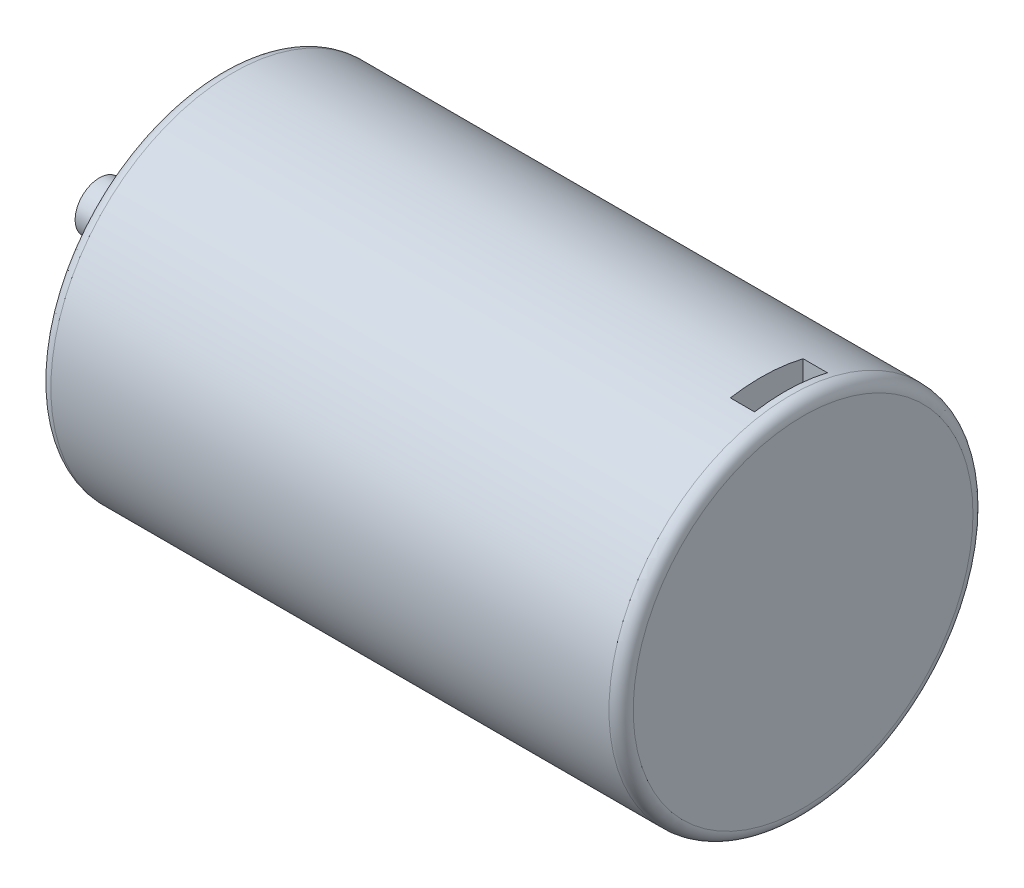
ISO-10303-21;
HEADER;
FILE_DESCRIPTION(('STEP AP214'),'2;1');
FILE_NAME('part.step','',(''),(''),'','','');
FILE_SCHEMA(('AUTOMOTIVE_DESIGN { 1 0 10303 214 1 1 1 1 }'));
ENDSEC;
DATA;
#1=APPLICATION_CONTEXT('core data for automotive mechanical design processes');
#2=APPLICATION_PROTOCOL_DEFINITION('international standard','automotive_design',2000,#1);
#3=PRODUCT_CONTEXT('',#1,'mechanical');
#4=PRODUCT('Part','Part','',(#3));
#5=PRODUCT_RELATED_PRODUCT_CATEGORY('part','',(#4));
#6=PRODUCT_DEFINITION_FORMATION('','',#4);
#7=PRODUCT_DEFINITION_CONTEXT('part definition',#1,'design');
#8=PRODUCT_DEFINITION('design','',#6,#7);
#9=PRODUCT_DEFINITION_SHAPE('','',#8);
#10=(LENGTH_UNIT() NAMED_UNIT(*) SI_UNIT(.MILLI.,.METRE.));
#11=(NAMED_UNIT(*) PLANE_ANGLE_UNIT() SI_UNIT($,.RADIAN.));
#12=(NAMED_UNIT(*) SI_UNIT($,.STERADIAN.) SOLID_ANGLE_UNIT());
#13=UNCERTAINTY_MEASURE_WITH_UNIT(LENGTH_MEASURE(1.E-05),#10,'distance_accuracy_value','');
#14=(GEOMETRIC_REPRESENTATION_CONTEXT(3) GLOBAL_UNCERTAINTY_ASSIGNED_CONTEXT((#13)) GLOBAL_UNIT_ASSIGNED_CONTEXT((#10,
#11,#12)) REPRESENTATION_CONTEXT('',''));
#15=CARTESIAN_POINT('',(0.,0.,0.));
#16=DIRECTION('',(0.,0.,1.));
#17=DIRECTION('',(1.,0.,0.));
#18=AXIS2_PLACEMENT_3D('',#15,#16,#17);
#19=CARTESIAN_POINT('',(-48.,0.,0.));
#20=DIRECTION('',(1.,0.,0.));
#21=DIRECTION('',(0.,0.,-1.));
#22=AXIS2_PLACEMENT_3D('',#19,#20,#21);
#23=CYLINDRICAL_SURFACE('',#22,15.);
#24=CARTESIAN_POINT('',(-1.5,0.,0.));
#25=DIRECTION('',(1.,0.,0.));
#26=DIRECTION('',(0.,0.,-1.));
#27=AXIS2_PLACEMENT_3D('',#24,#25,#26);
#28=CIRCLE('',#27,15.);
#29=CARTESIAN_POINT('',(-1.5,14.790199457749,2.5));
#30=VERTEX_POINT('',#29);
#31=CARTESIAN_POINT('',(-1.5,14.5859521458148,-3.5));
#32=VERTEX_POINT('',#31);
#33=EDGE_CURVE('E128',#30,#32,#28,.F.);
#34=ORIENTED_EDGE('',*,*,#33,.F.);
#35=DIRECTION('',(1.,0.,0.));
#36=VECTOR('',#35,1.);
#37=CARTESIAN_POINT('',(-48.,14.790199457749,2.5));
#38=LINE('',#37,#36);
#39=CARTESIAN_POINT('',(-3.5,14.790199457749,2.5));
#40=VERTEX_POINT('',#39);
#41=EDGE_CURVE('E11',#40,#30,#38,.T.);
#42=ORIENTED_EDGE('',*,*,#41,.F.);
#43=CARTESIAN_POINT('',(-3.5,0.,0.));
#44=DIRECTION('',(-1.,0.,0.));
#45=DIRECTION('',(0.,0.,1.));
#46=AXIS2_PLACEMENT_3D('',#43,#44,#45);
#47=CIRCLE('',#46,15.);
#48=CARTESIAN_POINT('',(-3.5,14.5859521458148,-3.5));
#49=VERTEX_POINT('',#48);
#50=EDGE_CURVE('E43',#49,#40,#47,.F.);
#51=ORIENTED_EDGE('',*,*,#50,.F.);
#52=DIRECTION('',(1.,0.,0.));
#53=VECTOR('',#52,1.);
#54=CARTESIAN_POINT('',(-48.,14.5859521458148,-3.5));
#55=LINE('',#54,#53);
#56=EDGE_CURVE('E130',#32,#49,#55,.F.);
#57=ORIENTED_EDGE('',*,*,#56,.F.);
#58=EDGE_LOOP('',(#34,#42,#51,#57));
#59=FACE_BOUND('',#58,.T.);
#60=CARTESIAN_POINT('',(-1.,0.,0.));
#61=DIRECTION('',(1.,0.,0.));
#62=DIRECTION('',(0.,0.,-1.));
#63=AXIS2_PLACEMENT_3D('',#60,#61,#62);
#64=CIRCLE('',#63,15.);
#65=CARTESIAN_POINT('',(-1.,0.,-15.));
#66=VERTEX_POINT('',#65);
#67=EDGE_CURVE('E125',#66,#66,#64,.F.);
#68=ORIENTED_EDGE('',*,*,#67,.T.);
#69=EDGE_LOOP('',(#68));
#70=FACE_BOUND('',#69,.T.);
#71=CARTESIAN_POINT('',(-47.,0.,0.));
#72=DIRECTION('',(1.,0.,0.));
#73=DIRECTION('',(0.,0.,-1.));
#74=AXIS2_PLACEMENT_3D('',#71,#72,#73);
#75=CIRCLE('',#74,15.);
#76=CARTESIAN_POINT('',(-47.,0.,-15.));
#77=VERTEX_POINT('',#76);
#78=EDGE_CURVE('E116',#77,#77,#75,.T.);
#79=ORIENTED_EDGE('',*,*,#78,.T.);
#80=EDGE_LOOP('',(#79));
#81=FACE_BOUND('',#80,.T.);
#82=ADVANCED_FACE('F35',(#59,#70,#81),#23,.T.);
#83=CARTESIAN_POINT('',(-48.,0.,0.));
#84=DIRECTION('',(1.,0.,0.));
#85=DIRECTION('',(0.,0.,-1.));
#86=AXIS2_PLACEMENT_3D('',#83,#84,#85);
#87=PLANE('',#86);
#88=CARTESIAN_POINT('',(-48.,0.,0.));
#89=DIRECTION('',(1.,0.,0.));
#90=DIRECTION('',(0.,0.,-1.));
#91=AXIS2_PLACEMENT_3D('',#88,#89,#90);
#92=CIRCLE('',#91,14.);
#93=CARTESIAN_POINT('',(-48.,0.,-14.));
#94=VERTEX_POINT('',#93);
#95=EDGE_CURVE('E119',#94,#94,#92,.F.);
#96=ORIENTED_EDGE('',*,*,#95,.T.);
#97=EDGE_LOOP('',(#96));
#98=FACE_BOUND('',#97,.T.);
#99=CARTESIAN_POINT('',(-48.,0.,0.));
#100=DIRECTION('',(1.,0.,0.));
#101=DIRECTION('',(0.,0.,-1.));
#102=AXIS2_PLACEMENT_3D('',#99,#100,#101);
#103=CIRCLE('',#102,3.);
#104=CARTESIAN_POINT('',(-48.,0.,-3.));
#105=VERTEX_POINT('',#104);
#106=EDGE_CURVE('E111',#105,#105,#103,.F.);
#107=ORIENTED_EDGE('',*,*,#106,.F.);
#108=EDGE_LOOP('',(#107));
#109=FACE_BOUND('',#108,.T.);
#110=ADVANCED_FACE('F145',(#98,#109),#87,.F.);
#111=CARTESIAN_POINT('',(0.,0.,0.));
#112=DIRECTION('',(1.,0.,0.));
#113=DIRECTION('',(0.,0.,-1.));
#114=AXIS2_PLACEMENT_3D('',#111,#112,#113);
#115=PLANE('',#114);
#116=CARTESIAN_POINT('',(0.,0.,0.));
#117=DIRECTION('',(1.,0.,0.));
#118=DIRECTION('',(0.,0.,-1.));
#119=AXIS2_PLACEMENT_3D('',#116,#117,#118);
#120=CIRCLE('',#119,14.);
#121=CARTESIAN_POINT('',(0.,0.,-14.));
#122=VERTEX_POINT('',#121);
#123=EDGE_CURVE('E122',#122,#122,#120,.T.);
#124=ORIENTED_EDGE('',*,*,#123,.T.);
#125=EDGE_LOOP('',(#124));
#126=FACE_BOUND('',#125,.T.);
#127=ADVANCED_FACE('F150',(#126),#115,.T.);
#128=CARTESIAN_POINT('',(-51.,0.,0.));
#129=DIRECTION('',(1.,0.,0.));
#130=DIRECTION('',(0.,0.,-1.));
#131=AXIS2_PLACEMENT_3D('',#128,#129,#130);
#132=CYLINDRICAL_SURFACE('',#131,3.);
#133=CARTESIAN_POINT('',(-51.,0.,0.));
#134=DIRECTION('',(-1.,0.,0.));
#135=DIRECTION('',(0.,0.,1.));
#136=AXIS2_PLACEMENT_3D('',#133,#134,#135);
#137=CIRCLE('',#136,3.);
#138=CARTESIAN_POINT('',(-51.,0.,3.));
#139=VERTEX_POINT('',#138);
#140=EDGE_CURVE('E100',#139,#139,#137,.T.);
#141=ORIENTED_EDGE('',*,*,#140,.F.);
#142=EDGE_LOOP('',(#141));
#143=FACE_BOUND('',#142,.T.);
#144=ORIENTED_EDGE('',*,*,#106,.T.);
#145=EDGE_LOOP('',(#144));
#146=FACE_BOUND('',#145,.T.);
#147=ADVANCED_FACE('F173',(#143,#146),#132,.T.);
#148=CARTESIAN_POINT('',(-51.,0.,0.));
#149=DIRECTION('',(-1.,0.,0.));
#150=DIRECTION('',(0.,0.,1.));
#151=AXIS2_PLACEMENT_3D('',#148,#149,#150);
#152=PLANE('',#151);
#153=CARTESIAN_POINT('',(-51.,0.,0.));
#154=DIRECTION('',(-1.,0.,0.));
#155=DIRECTION('',(0.,0.,1.));
#156=AXIS2_PLACEMENT_3D('',#153,#154,#155);
#157=CIRCLE('',#156,2.);
#158=CARTESIAN_POINT('',(-51.,0.,2.));
#159=VERTEX_POINT('',#158);
#160=EDGE_CURVE('E107',#159,#159,#157,.T.);
#161=ORIENTED_EDGE('',*,*,#160,.F.);
#162=EDGE_LOOP('',(#161));
#163=FACE_BOUND('',#162,.T.);
#164=ORIENTED_EDGE('',*,*,#140,.T.);
#165=EDGE_LOOP('',(#164));
#166=FACE_BOUND('',#165,.T.);
#167=ADVANCED_FACE('F175',(#163,#166),#152,.T.);
#168=CARTESIAN_POINT('',(-58.,0.,0.));
#169=DIRECTION('',(-1.,0.,0.));
#170=DIRECTION('',(0.,0.,1.));
#171=AXIS2_PLACEMENT_3D('',#168,#169,#170);
#172=PLANE('',#171);
#173=CARTESIAN_POINT('',(-58.,0.,0.));
#174=DIRECTION('',(-1.,0.,0.));
#175=DIRECTION('',(0.,0.,1.));
#176=AXIS2_PLACEMENT_3D('',#173,#174,#175);
#177=CIRCLE('',#176,2.);
#178=CARTESIAN_POINT('',(-58.,0.,2.));
#179=VERTEX_POINT('',#178);
#180=EDGE_CURVE('E108',#179,#179,#177,.T.);
#181=ORIENTED_EDGE('',*,*,#180,.T.);
#182=EDGE_LOOP('',(#181));
#183=FACE_BOUND('',#182,.T.);
#184=ADVANCED_FACE('F163',(#183),#172,.T.);
#185=CARTESIAN_POINT('',(-58.,0.,0.));
#186=DIRECTION('',(1.,0.,0.));
#187=DIRECTION('',(0.,0.,-1.));
#188=AXIS2_PLACEMENT_3D('',#185,#186,#187);
#189=CYLINDRICAL_SURFACE('',#188,2.);
#190=ORIENTED_EDGE('',*,*,#160,.T.);
#191=EDGE_LOOP('',(#190));
#192=FACE_BOUND('',#191,.T.);
#193=ORIENTED_EDGE('',*,*,#180,.F.);
#194=EDGE_LOOP('',(#193));
#195=FACE_BOUND('',#194,.T.);
#196=ADVANCED_FACE('F156',(#192,#195),#189,.T.);
#197=CARTESIAN_POINT('',(-47.,0.,0.));
#198=DIRECTION('',(1.,0.,0.));
#199=DIRECTION('',(0.,0.,-1.));
#200=AXIS2_PLACEMENT_3D('',#197,#198,#199);
#201=TOROIDAL_SURFACE('',#200,14.,1.);
#202=ORIENTED_EDGE('',*,*,#95,.F.);
#203=EDGE_LOOP('',(#202));
#204=FACE_BOUND('',#203,.T.);
#205=ORIENTED_EDGE('',*,*,#78,.F.);
#206=EDGE_LOOP('',(#205));
#207=FACE_BOUND('',#206,.T.);
#208=ADVANCED_FACE('F154',(#204,#207),#201,.T.);
#209=CARTESIAN_POINT('',(-1.,0.,0.));
#210=DIRECTION('',(1.,0.,0.));
#211=DIRECTION('',(0.,0.,-1.));
#212=AXIS2_PLACEMENT_3D('',#209,#210,#211);
#213=TOROIDAL_SURFACE('',#212,14.,1.);
#214=ORIENTED_EDGE('',*,*,#67,.F.);
#215=EDGE_LOOP('',(#214));
#216=FACE_BOUND('',#215,.T.);
#217=ORIENTED_EDGE('',*,*,#123,.F.);
#218=EDGE_LOOP('',(#217));
#219=FACE_BOUND('',#218,.T.);
#220=ADVANCED_FACE('F37',(#216,#219),#213,.T.);
#221=CARTESIAN_POINT('',(-3.5,12.,-3.5));
#222=DIRECTION('',(-1.,0.,0.));
#223=DIRECTION('',(0.,0.,1.));
#224=AXIS2_PLACEMENT_3D('',#221,#222,#223);
#225=PLANE('',#224);
#226=DIRECTION('',(0.,1.,0.));
#227=VECTOR('',#226,1.);
#228=CARTESIAN_POINT('',(-3.5,12.,-3.5));
#229=LINE('',#228,#227);
#230=CARTESIAN_POINT('',(-3.5,12.,-3.5));
#231=VERTEX_POINT('',#230);
#232=EDGE_CURVE('E98',#231,#49,#229,.T.);
#233=ORIENTED_EDGE('',*,*,#232,.T.);
#234=ORIENTED_EDGE('',*,*,#50,.T.);
#235=DIRECTION('',(0.,1.,0.));
#236=VECTOR('',#235,1.);
#237=CARTESIAN_POINT('',(-3.5,12.,2.5));
#238=LINE('',#237,#236);
#239=CARTESIAN_POINT('',(-3.5,12.,2.5));
#240=VERTEX_POINT('',#239);
#241=EDGE_CURVE('E49',#240,#40,#238,.T.);
#242=ORIENTED_EDGE('',*,*,#241,.F.);
#243=DIRECTION('',(0.,0.,1.));
#244=VECTOR('',#243,1.);
#245=CARTESIAN_POINT('',(-3.5,12.,-3.5));
#246=LINE('',#245,#244);
#247=EDGE_CURVE('E78',#231,#240,#246,.T.);
#248=ORIENTED_EDGE('',*,*,#247,.F.);
#249=EDGE_LOOP('',(#233,#234,#242,#248));
#250=FACE_BOUND('',#249,.T.);
#251=ADVANCED_FACE('F76',(#250),#225,.F.);
#252=CARTESIAN_POINT('',(-3.5,12.,-3.5));
#253=DIRECTION('',(0.,0.,-1.));
#254=DIRECTION('',(-1.,0.,0.));
#255=AXIS2_PLACEMENT_3D('',#252,#253,#254);
#256=PLANE('',#255);
#257=ORIENTED_EDGE('',*,*,#56,.T.);
#258=ORIENTED_EDGE('',*,*,#232,.F.);
#259=DIRECTION('',(-1.,0.,0.));
#260=VECTOR('',#259,1.);
#261=CARTESIAN_POINT('',(-3.5,12.,-3.5));
#262=LINE('',#261,#260);
#263=CARTESIAN_POINT('',(-1.5,12.,-3.5));
#264=VERTEX_POINT('',#263);
#265=EDGE_CURVE('E81',#264,#231,#262,.T.);
#266=ORIENTED_EDGE('',*,*,#265,.F.);
#267=DIRECTION('',(0.,1.,0.));
#268=VECTOR('',#267,1.);
#269=CARTESIAN_POINT('',(-1.5,12.,-3.5));
#270=LINE('',#269,#268);
#271=EDGE_CURVE('E101',#264,#32,#270,.T.);
#272=ORIENTED_EDGE('',*,*,#271,.T.);
#273=EDGE_LOOP('',(#257,#258,#266,#272));
#274=FACE_BOUND('',#273,.T.);
#275=ADVANCED_FACE('F132',(#274),#256,.F.);
#276=CARTESIAN_POINT('',(-1.5,12.,-3.5));
#277=DIRECTION('',(1.,0.,0.));
#278=DIRECTION('',(0.,0.,-1.));
#279=AXIS2_PLACEMENT_3D('',#276,#277,#278);
#280=PLANE('',#279);
#281=DIRECTION('',(0.,1.,0.));
#282=VECTOR('',#281,1.);
#283=CARTESIAN_POINT('',(-1.5,12.,2.5));
#284=LINE('',#283,#282);
#285=CARTESIAN_POINT('',(-1.5,12.,2.5));
#286=VERTEX_POINT('',#285);
#287=EDGE_CURVE('E80',#286,#30,#284,.T.);
#288=ORIENTED_EDGE('',*,*,#287,.T.);
#289=ORIENTED_EDGE('',*,*,#33,.T.);
#290=ORIENTED_EDGE('',*,*,#271,.F.);
#291=DIRECTION('',(0.,0.,-1.));
#292=VECTOR('',#291,1.);
#293=CARTESIAN_POINT('',(-1.5,12.,-3.5));
#294=LINE('',#293,#292);
#295=EDGE_CURVE('E90',#286,#264,#294,.T.);
#296=ORIENTED_EDGE('',*,*,#295,.F.);
#297=EDGE_LOOP('',(#288,#289,#290,#296));
#298=FACE_BOUND('',#297,.T.);
#299=ADVANCED_FACE('F135',(#298),#280,.F.);
#300=CARTESIAN_POINT('',(-3.5,12.,2.5));
#301=DIRECTION('',(0.,0.,1.));
#302=DIRECTION('',(1.,0.,0.));
#303=AXIS2_PLACEMENT_3D('',#300,#301,#302);
#304=PLANE('',#303);
#305=ORIENTED_EDGE('',*,*,#41,.T.);
#306=ORIENTED_EDGE('',*,*,#287,.F.);
#307=DIRECTION('',(1.,0.,0.));
#308=VECTOR('',#307,1.);
#309=CARTESIAN_POINT('',(-3.5,12.,2.5));
#310=LINE('',#309,#308);
#311=EDGE_CURVE('E84',#240,#286,#310,.T.);
#312=ORIENTED_EDGE('',*,*,#311,.F.);
#313=ORIENTED_EDGE('',*,*,#241,.T.);
#314=EDGE_LOOP('',(#305,#306,#312,#313));
#315=FACE_BOUND('',#314,.T.);
#316=ADVANCED_FACE('F85',(#315),#304,.F.);
#317=CARTESIAN_POINT('',(0.,12.,0.));
#318=DIRECTION('',(0.,1.,0.));
#319=DIRECTION('',(0.,0.,1.));
#320=AXIS2_PLACEMENT_3D('',#317,#318,#319);
#321=PLANE('',#320);
#322=ORIENTED_EDGE('',*,*,#247,.T.);
#323=ORIENTED_EDGE('',*,*,#311,.T.);
#324=ORIENTED_EDGE('',*,*,#295,.T.);
#325=ORIENTED_EDGE('',*,*,#265,.T.);
#326=EDGE_LOOP('',(#322,#323,#324,#325));
#327=FACE_BOUND('',#326,.T.);
#328=ADVANCED_FACE('F92',(#327),#321,.T.);
#329=CLOSED_SHELL('',(#82,#110,#127,#147,#167,#184,#196,#208,#220,#251,#275,#299,#316,#328));
#330=MANIFOLD_SOLID_BREP('B2',#329);
#331=ADVANCED_BREP_SHAPE_REPRESENTATION('',(#18,#330),#14);
#332=SHAPE_DEFINITION_REPRESENTATION(#9,#331);
ENDSEC;
END-ISO-10303-21;
